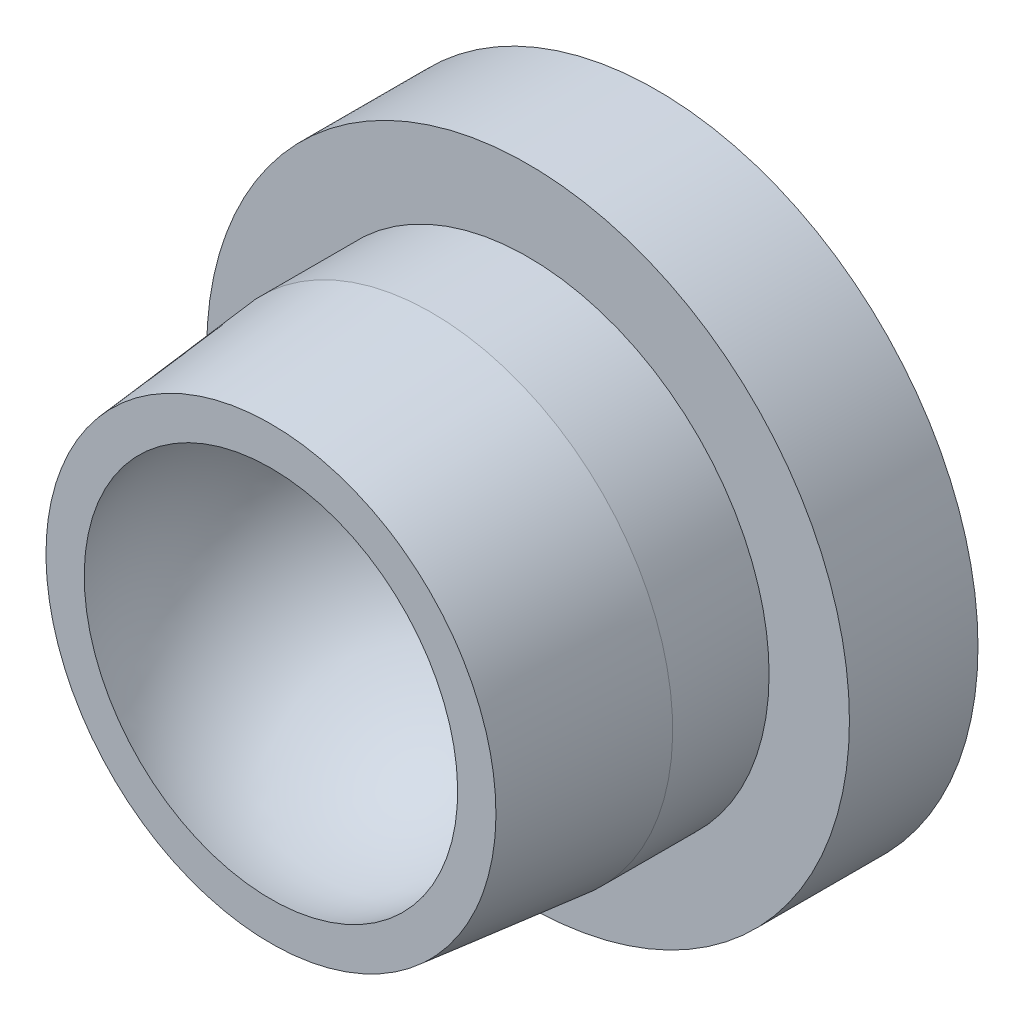
ISO-10303-21;
HEADER;
FILE_DESCRIPTION(('STEP AP214'),'2;1');
FILE_NAME('part.step','',(''),(''),'','','');
FILE_SCHEMA(('AUTOMOTIVE_DESIGN { 1 0 10303 214 1 1 1 1 }'));
ENDSEC;
DATA;
#1=APPLICATION_CONTEXT('core data for automotive mechanical design processes');
#2=APPLICATION_PROTOCOL_DEFINITION('international standard','automotive_design',2000,#1);
#3=PRODUCT_CONTEXT('',#1,'mechanical');
#4=PRODUCT('Part','Part','',(#3));
#5=PRODUCT_RELATED_PRODUCT_CATEGORY('part','',(#4));
#6=PRODUCT_DEFINITION_FORMATION('','',#4);
#7=PRODUCT_DEFINITION_CONTEXT('part definition',#1,'design');
#8=PRODUCT_DEFINITION('design','',#6,#7);
#9=PRODUCT_DEFINITION_SHAPE('','',#8);
#10=(LENGTH_UNIT() NAMED_UNIT(*) SI_UNIT(.MILLI.,.METRE.));
#11=(NAMED_UNIT(*) PLANE_ANGLE_UNIT() SI_UNIT($,.RADIAN.));
#12=(NAMED_UNIT(*) SI_UNIT($,.STERADIAN.) SOLID_ANGLE_UNIT());
#13=UNCERTAINTY_MEASURE_WITH_UNIT(LENGTH_MEASURE(1.E-05),#10,'distance_accuracy_value','');
#14=(GEOMETRIC_REPRESENTATION_CONTEXT(3) GLOBAL_UNCERTAINTY_ASSIGNED_CONTEXT((#13)) GLOBAL_UNIT_ASSIGNED_CONTEXT((#10,
#11,#12)) REPRESENTATION_CONTEXT('',''));
#15=CARTESIAN_POINT('',(0.,0.,0.));
#16=DIRECTION('',(0.,0.,1.));
#17=DIRECTION('',(1.,0.,0.));
#18=AXIS2_PLACEMENT_3D('',#15,#16,#17);
#19=CARTESIAN_POINT('',(0.,0.,4.));
#20=DIRECTION('',(0.,0.,-1.));
#21=DIRECTION('',(-1.,0.,0.));
#22=AXIS2_PLACEMENT_3D('',#19,#20,#21);
#23=CYLINDRICAL_SURFACE('',#22,10.);
#24=CARTESIAN_POINT('',(0.,0.,4.));
#25=DIRECTION('',(0.,0.,1.));
#26=DIRECTION('',(1.,0.,0.));
#27=AXIS2_PLACEMENT_3D('',#24,#25,#26);
#28=CIRCLE('',#27,10.);
#29=CARTESIAN_POINT('',(10.,0.,4.));
#30=VERTEX_POINT('',#29);
#31=EDGE_CURVE('E11',#30,#30,#28,.T.);
#32=ORIENTED_EDGE('',*,*,#31,.F.);
#33=EDGE_LOOP('',(#32));
#34=FACE_BOUND('',#33,.T.);
#35=CARTESIAN_POINT('',(0.,0.,0.));
#36=DIRECTION('',(0.,0.,1.));
#37=DIRECTION('',(1.,0.,0.));
#38=AXIS2_PLACEMENT_3D('',#35,#36,#37);
#39=CIRCLE('',#38,10.);
#40=CARTESIAN_POINT('',(10.,0.,0.));
#41=VERTEX_POINT('',#40);
#42=EDGE_CURVE('E64',#41,#41,#39,.T.);
#43=ORIENTED_EDGE('',*,*,#42,.T.);
#44=EDGE_LOOP('',(#43));
#45=FACE_BOUND('',#44,.T.);
#46=ADVANCED_FACE('F56',(#34,#45),#23,.T.);
#47=CARTESIAN_POINT('',(0.,0.,4.));
#48=DIRECTION('',(0.,0.,1.));
#49=DIRECTION('',(1.,0.,0.));
#50=AXIS2_PLACEMENT_3D('',#47,#48,#49);
#51=PLANE('',#50);
#52=CARTESIAN_POINT('',(0.,0.,4.));
#53=DIRECTION('',(0.,0.,1.));
#54=DIRECTION('',(1.,0.,0.));
#55=AXIS2_PLACEMENT_3D('',#52,#53,#54);
#56=CIRCLE('',#55,7.5);
#57=CARTESIAN_POINT('',(7.5,0.,4.));
#58=VERTEX_POINT('',#57);
#59=EDGE_CURVE('E73',#58,#58,#56,.T.);
#60=ORIENTED_EDGE('',*,*,#59,.F.);
#61=EDGE_LOOP('',(#60));
#62=FACE_BOUND('',#61,.T.);
#63=ORIENTED_EDGE('',*,*,#31,.T.);
#64=EDGE_LOOP('',(#63));
#65=FACE_BOUND('',#64,.T.);
#66=ADVANCED_FACE('F102',(#62,#65),#51,.T.);
#67=CARTESIAN_POINT('',(0.,0.,0.));
#68=DIRECTION('',(0.,0.,1.));
#69=DIRECTION('',(1.,0.,0.));
#70=AXIS2_PLACEMENT_3D('',#67,#68,#69);
#71=PLANE('',#70);
#72=CARTESIAN_POINT('',(0.,0.,0.));
#73=DIRECTION('',(0.,0.,-1.));
#74=DIRECTION('',(-1.,0.,0.));
#75=AXIS2_PLACEMENT_3D('',#72,#73,#74);
#76=CIRCLE('',#75,4.);
#77=CARTESIAN_POINT('',(-4.,0.,0.));
#78=VERTEX_POINT('',#77);
#79=EDGE_CURVE('E229',#78,#78,#76,.T.);
#80=ORIENTED_EDGE('',*,*,#79,.F.);
#81=EDGE_LOOP('',(#80));
#82=FACE_BOUND('',#81,.T.);
#83=ORIENTED_EDGE('',*,*,#42,.F.);
#84=EDGE_LOOP('',(#83));
#85=FACE_BOUND('',#84,.T.);
#86=ADVANCED_FACE('F104',(#82,#85),#71,.F.);
#87=CARTESIAN_POINT('',(0.,0.,7.));
#88=DIRECTION('',(0.,0.,-1.));
#89=DIRECTION('',(-1.,0.,0.));
#90=AXIS2_PLACEMENT_3D('',#87,#88,#89);
#91=CYLINDRICAL_SURFACE('',#90,7.5);
#92=CARTESIAN_POINT('',(0.,0.,7.));
#93=DIRECTION('',(0.,0.,1.));
#94=DIRECTION('',(0.956631448797978,0.291300997544948,0.));
#95=AXIS2_PLACEMENT_3D('',#92,#93,#94);
#96=CIRCLE('',#95,7.5);
#97=CARTESIAN_POINT('',(7.17473586598483,2.18475748158711,7.));
#98=VERTEX_POINT('',#97);
#99=EDGE_CURVE('E219',#98,#98,#96,.T.);
#100=ORIENTED_EDGE('',*,*,#99,.F.);
#101=EDGE_LOOP('',(#100));
#102=FACE_BOUND('',#101,.T.);
#103=ORIENTED_EDGE('',*,*,#59,.T.);
#104=EDGE_LOOP('',(#103));
#105=FACE_BOUND('',#104,.T.);
#106=ADVANCED_FACE('F99',(#102,#105),#91,.T.);
#107=CARTESIAN_POINT('',(0.,0.,12.));
#108=DIRECTION('',(0.,0.,-1.));
#109=DIRECTION('',(-1.,0.,0.));
#110=AXIS2_PLACEMENT_3D('',#107,#108,#109);
#111=CONICAL_SURFACE('',#110,7.,0.0996686524911619);
#112=ORIENTED_EDGE('',*,*,#99,.T.);
#113=EDGE_LOOP('',(#112));
#114=FACE_BOUND('',#113,.T.);
#115=CARTESIAN_POINT('',(7.,0.,12.));
#116=CARTESIAN_POINT('',(7.00000946857829,0.11464018395197,12.));
#117=CARTESIAN_POINT('',(6.99720879617349,0.229281871367744,12.));
#118=CARTESIAN_POINT('',(6.98599072781425,0.458036028501143,12.));
#119=CARTESIAN_POINT('',(6.97758575244608,0.572149107844095,12.));
#120=CARTESIAN_POINT('',(6.95516042019812,0.79984619188303,12.));
#121=CARTESIAN_POINT('',(6.94113890730901,0.913430082788463,12.));
#122=CARTESIAN_POINT('',(6.90750110692619,1.14006992217185,12.));
#123=CARTESIAN_POINT('',(6.88787023727116,1.25312370366495,12.));
#124=CARTESIAN_POINT('',(6.84314425725322,1.47803736977828,12.));
#125=CARTESIAN_POINT('',(6.81805418703437,1.58989825645446,12.));
#126=CARTESIAN_POINT('',(6.76244881002624,1.81202574953683,12.));
#127=CARTESIAN_POINT('',(6.73194449252415,1.92229510503542,12.));
#128=CARTESIAN_POINT('',(6.66552663968088,2.14124188785816,12.));
#129=CARTESIAN_POINT('',(6.62961088236125,2.24991864104084,12.));
#130=CARTESIAN_POINT('',(6.55238689502207,2.4656851734139,12.));
#131=CARTESIAN_POINT('',(6.51106369033482,2.572769590401,12.));
#132=CARTESIAN_POINT('',(6.42330369269825,2.7846682525361,12.));
#133=CARTESIAN_POINT('',(6.37687324275265,2.88948512443638,12.));
#134=CARTESIAN_POINT('',(6.27900174706836,3.09649656838717,12.));
#135=CARTESIAN_POINT('',(6.22757094440642,3.19869598109569,12.));
#136=CARTESIAN_POINT('',(6.11971479620022,3.40047824528328,12.));
#137=CARTESIAN_POINT('',(6.0632874029601,3.50006000211439,12.));
#138=CARTESIAN_POINT('',(5.9454533167807,3.69661499853515,12.));
#139=CARTESIAN_POINT('',(5.88403298289373,3.793580057493,12.));
#140=CARTESIAN_POINT('',(5.75661988375742,3.98428601736692,12.));
#141=CARTESIAN_POINT('',(5.69063282716388,4.0780307320159,12.));
#142=CARTESIAN_POINT('',(5.55425597743965,4.26197072822602,12.));
#143=CARTESIAN_POINT('',(5.48387528620885,4.35217275576092,12.));
#144=CARTESIAN_POINT('',(5.33872579624756,4.52903613944531,12.));
#145=CARTESIAN_POINT('',(5.26395520272269,4.61569602249469,12.));
#146=CARTESIAN_POINT('',(5.11003928805721,4.78548598000882,12.));
#147=CARTESIAN_POINT('',(5.03088218403733,4.86860536981319,12.));
#148=CARTESIAN_POINT('',(4.8687124047155,5.03078990558958,12.));
#149=CARTESIAN_POINT('',(4.78570458435669,5.10985990571818,12.));
#150=CARTESIAN_POINT('',(4.61606326447708,5.26365974295388,12.));
#151=CARTESIAN_POINT('',(4.52943737589153,5.33839797210532,12.));
#152=CARTESIAN_POINT('',(4.35257255820102,5.48354571472726,12.));
#153=CARTESIAN_POINT('',(4.26233215617571,5.55395343325583,12.));
#154=CARTESIAN_POINT('',(4.0782493151659,5.69045341899084,12.));
#155=CARTESIAN_POINT('',(3.98439740418066,5.75653290811392,12.));
#156=CARTESIAN_POINT('',(3.79370303838427,5.88396335904334,12.));
#157=CARTESIAN_POINT('',(3.69686439823091,5.94532002888742,12.));
#158=CARTESIAN_POINT('',(3.50047782897218,6.06306926565418,12.));
#159=CARTESIAN_POINT('',(3.40093572735347,6.11947154819027,12.));
#160=CARTESIAN_POINT('',(3.19915239769337,6.22732570340105,12.));
#161=CARTESIAN_POINT('',(3.09691007520921,6.27877552827064,12.));
#162=CARTESIAN_POINT('',(2.88973450820007,6.37673992432441,12.));
#163=CARTESIAN_POINT('',(2.7847944665566,6.42324011505685,12.));
#164=CARTESIAN_POINT('',(2.57290379182113,6.51101940037376,12.));
#165=CARTESIAN_POINT('',(2.46595578650642,6.5523048375204,12.));
#166=CARTESIAN_POINT('',(2.25037099359016,6.62947843668381,12.));
#167=CARTESIAN_POINT('',(2.14173802607961,6.66537726451744,12.));
#168=CARTESIAN_POINT('',(1.92279060464739,6.73179305761763,12.));
#169=CARTESIAN_POINT('',(1.8124754768193,6.7623078009119,12.));
#170=CARTESIAN_POINT('',(1.59016882466571,6.81797189048315,12.));
#171=CARTESIAN_POINT('',(1.47817343931341,6.84310580657271,12.));
#172=CARTESIAN_POINT('',(1.25322929543939,6.88786061756933,12.));
#173=CARTESIAN_POINT('',(1.14028187683046,6.9074882458219,12.));
#174=CARTESIAN_POINT('',(0.913783662947152,6.94112046924525,12.));
#175=CARTESIAN_POINT('',(0.800234533564133,6.955136270555,12.));
#176=CARTESIAN_POINT('',(0.572537046978295,6.97756137986217,12.));
#177=CARTESIAN_POINT('',(0.458388462303277,6.98596837710925,12.));
#178=CARTESIAN_POINT('',(0.229493844976463,6.99719302045284,12.));
#179=CARTESIAN_POINT('',(0.114747035766647,6.9999947795997,12.));
#180=CARTESIAN_POINT('',(-0.114606099946494,7.00000521398844,12.));
#181=CARTESIAN_POINT('',(-0.229212425893632,6.99722075460051,12.));
#182=CARTESIAN_POINT('',(-0.457919861405459,6.98601913479883,12.));
#183=CARTESIAN_POINT('',(-0.572021523297677,6.97761329020051,12.));
#184=CARTESIAN_POINT('',(-0.799718788321861,6.95518593134012,12.));
#185=CARTESIAN_POINT('',(-0.913314163750184,6.9411621063505,12.));
#186=CARTESIAN_POINT('',(-1.1400004544726,6.90751594671759,12.));
#187=CARTESIAN_POINT('',(-1.25308903201324,6.88787787888898,12.));
#188=CARTESIAN_POINT('',(-1.47803724718358,6.84314353568217,12.));
#189=CARTESIAN_POINT('',(-1.58989822363506,6.81805399386651,12.));
#190=CARTESIAN_POINT('',(-1.8120257822897,6.76244900280689,12.));
#191=CARTESIAN_POINT('',(-1.92229511381365,6.73194454419437,12.));
#192=CARTESIAN_POINT('',(-2.1412418790754,6.66552658799002,12.));
#193=CARTESIAN_POINT('',(-2.24991863868423,6.62961086849339,12.));
#194=CARTESIAN_POINT('',(-2.46568517577652,6.55238690892964,12.));
#195=CARTESIAN_POINT('',(-2.5727695910336,6.51106369405901,12.));
#196=CARTESIAN_POINT('',(-2.78466825190427,6.42330368897864,12.));
#197=CARTESIAN_POINT('',(-2.88948512426743,6.37687324175675,12.));
#198=CARTESIAN_POINT('',(-3.09649656855639,6.27900174806183,12.));
#199=CARTESIAN_POINT('',(-3.19869598114137,6.22757094467247,12.));
#200=CARTESIAN_POINT('',(-3.40047824523843,6.11971479593347,12.));
#201=CARTESIAN_POINT('',(-3.50006000210263,6.06328740288836,12.));
#202=CARTESIAN_POINT('',(-3.69661499854756,5.94545331685223,12.));
#203=CARTESIAN_POINT('',(-3.79358005749637,5.88403298291284,12.));
#204=CARTESIAN_POINT('',(-3.98428601736387,5.75661988373812,12.));
#205=CARTESIAN_POINT('',(-4.07803073201542,5.69063282715849,12.));
#206=CARTESIAN_POINT('',(-4.26197072822755,5.55425597744434,12.));
#207=CARTESIAN_POINT('',(-4.35217275576189,5.48387528620974,12.));
#208=CARTESIAN_POINT('',(-4.52903613944581,5.33872579624571,12.));
#209=CARTESIAN_POINT('',(-4.6156960224953,5.26395520272189,12.));
#210=CARTESIAN_POINT('',(-4.78548598000929,5.11003928805732,12.));
#211=CARTESIAN_POINT('',(-4.8686053698134,5.03088218403729,12.));
#212=CARTESIAN_POINT('',(-5.03078990558964,4.86871240471526,12.));
#213=CARTESIAN_POINT('',(-5.10985990571831,4.78570458435639,12.));
#214=CARTESIAN_POINT('',(-5.2636597429541,4.61606326447664,12.));
#215=CARTESIAN_POINT('',(-5.33839797210557,4.52943737589103,12.));
#216=CARTESIAN_POINT('',(-5.48354571472751,4.35257255820051,12.));
#217=CARTESIAN_POINT('',(-5.55395343325606,4.26233215617525,12.));
#218=CARTESIAN_POINT('',(-5.69045341899098,4.07824931516562,12.));
#219=CARTESIAN_POINT('',(-5.75653290811399,3.98439740418052,12.));
#220=CARTESIAN_POINT('',(-5.88396335904335,3.7937030383843,12.));
#221=CARTESIAN_POINT('',(-5.94532002888742,3.69686439823097,12.));
#222=CARTESIAN_POINT('',(-6.0630692656542,3.50047782897228,12.));
#223=CARTESIAN_POINT('',(-6.11947154819028,3.40093572735357,12.));
#224=CARTESIAN_POINT('',(-6.22732570340107,3.19915239769348,12.));
#225=CARTESIAN_POINT('',(-6.27877552827066,3.0969100752093,12.));
#226=CARTESIAN_POINT('',(-6.37673992432442,2.88973450820012,12.));
#227=CARTESIAN_POINT('',(-6.42324011505686,2.78479446655663,12.));
#228=CARTESIAN_POINT('',(-6.51101940037365,2.57290379182133,12.));
#229=CARTESIAN_POINT('',(-6.5523048375202,2.46595578650681,12.));
#230=CARTESIAN_POINT('',(-6.62947843668348,2.25037099359083,12.));
#231=CARTESIAN_POINT('',(-6.66537726451707,2.14173802608034,12.));
#232=CARTESIAN_POINT('',(-6.73179305761726,1.92279060464812,12.));
#233=CARTESIAN_POINT('',(-6.76230780091156,1.81247547681997,12.));
#234=CARTESIAN_POINT('',(-6.81797189048294,1.59016882466612,12.));
#235=CARTESIAN_POINT('',(-6.84310580657261,1.47817343931361,12.));
#236=CARTESIAN_POINT('',(-6.88786061756932,1.25322929543968,12.));
#237=CARTESIAN_POINT('',(-6.9074882458219,1.14028187683105,12.));
#238=CARTESIAN_POINT('',(-6.94112046924527,0.913783662948119,12.));
#239=CARTESIAN_POINT('',(-6.95513627055501,0.800234533565194,12.));
#240=CARTESIAN_POINT('',(-6.97756137986218,0.572537046979354,12.));
#241=CARTESIAN_POINT('',(-6.98596837710926,0.45838846230424,12.));
#242=CARTESIAN_POINT('',(-6.99719302045284,0.229493844977042,12.));
#243=CARTESIAN_POINT('',(-6.9999947795997,0.114747035766936,12.));
#244=CARTESIAN_POINT('',(-7.00000521398844,-0.114606099946784,12.));
#245=CARTESIAN_POINT('',(-6.99722075460051,-0.229212425894214,12.));
#246=CARTESIAN_POINT('',(-6.98601913479883,-0.457919861406428,12.));
#247=CARTESIAN_POINT('',(-6.97761329020052,-0.572021523298744,12.));
#248=CARTESIAN_POINT('',(-6.95518593134013,-0.799718788322929,12.));
#249=CARTESIAN_POINT('',(-6.94116210635052,-0.913314163751156,12.));
#250=CARTESIAN_POINT('',(-6.9075159467176,-1.14000045447318,12.));
#251=CARTESIAN_POINT('',(-6.88787787888898,-1.25308903201354,12.));
#252=CARTESIAN_POINT('',(-6.84314353568213,-1.47803724718348,12.));
#253=CARTESIAN_POINT('',(-6.81805399386642,-1.58989822363485,12.));
#254=CARTESIAN_POINT('',(-6.76244900280674,-1.81202578228934,12.));
#255=CARTESIAN_POINT('',(-6.73194454419422,-1.92229511381326,12.));
#256=CARTESIAN_POINT('',(-6.66552658798986,-2.141241879075,12.));
#257=CARTESIAN_POINT('',(-6.62961086849324,-2.24991863868387,12.));
#258=CARTESIAN_POINT('',(-6.55238690892955,-2.4656851757763,12.));
#259=CARTESIAN_POINT('',(-6.51106369405898,-2.5727695910335,12.));
#260=CARTESIAN_POINT('',(-6.42330368897903,-2.78466825190351,12.));
#261=CARTESIAN_POINT('',(-6.37687324175754,-2.88948512426593,12.));
#262=CARTESIAN_POINT('',(-6.27900174806315,-3.09649656855388,12.));
#263=CARTESIAN_POINT('',(-6.22757094467392,-3.1986959811386,12.));
#264=CARTESIAN_POINT('',(-6.1197147959349,-3.40047824523566,12.));
#265=CARTESIAN_POINT('',(-6.06328740288964,-3.5000600021001,12.));
#266=CARTESIAN_POINT('',(-5.94545331685302,-3.69661499854605,12.));
#267=CARTESIAN_POINT('',(-5.88403298291325,-3.79358005749562,12.));
#268=CARTESIAN_POINT('',(-5.75661988373871,-3.98428601736312,12.));
#269=CARTESIAN_POINT('',(-5.69063282715969,-4.07803073201396,12.));
#270=CARTESIAN_POINT('',(-5.55425597744637,-4.26197072822512,12.));
#271=CARTESIAN_POINT('',(-5.48387528621195,-4.3521727557592,12.));
#272=CARTESIAN_POINT('',(-5.33872579624791,-4.52903613944312,12.));
#273=CARTESIAN_POINT('',(-5.26395520272388,-4.61569602249283,12.));
#274=CARTESIAN_POINT('',(-5.11003928805852,-4.78548598000781,12.));
#275=CARTESIAN_POINT('',(-5.0308821840379,-4.86860536981267,12.));
#276=CARTESIAN_POINT('',(-4.86871240471547,-5.03078990558955,12.));
#277=CARTESIAN_POINT('',(-4.78570458435682,-5.10985990571817,12.));
#278=CARTESIAN_POINT('',(-4.61606326447736,-5.26365974295388,12.));
#279=CARTESIAN_POINT('',(-4.52943737589182,-5.33839797210531,12.));
#280=CARTESIAN_POINT('',(-4.35257255820129,-5.48354571472725,12.));
#281=CARTESIAN_POINT('',(-4.26233215617596,-5.55395343325582,12.));
#282=CARTESIAN_POINT('',(-4.07824931516605,-5.69045341899084,12.));
#283=CARTESIAN_POINT('',(-3.98439740418074,-5.75653290811392,12.));
#284=CARTESIAN_POINT('',(-3.79370303838416,-5.88396335904337,12.));
#285=CARTESIAN_POINT('',(-3.69686439823069,-5.94532002888747,12.));
#286=CARTESIAN_POINT('',(-3.50047782897181,-6.06306926565428,12.));
#287=CARTESIAN_POINT('',(-3.40093572735306,-6.11947154819037,12.));
#288=CARTESIAN_POINT('',(-3.19915239769297,-6.22732570340116,12.));
#289=CARTESIAN_POINT('',(-3.09691007520884,-6.27877552827074,12.));
#290=CARTESIAN_POINT('',(-2.88973450819985,-6.37673992432447,12.));
#291=CARTESIAN_POINT('',(-2.78479446655649,-6.42324011505688,12.));
#292=CARTESIAN_POINT('',(-2.57290379182126,-6.51101940037372,12.));
#293=CARTESIAN_POINT('',(-2.46595578650666,-6.55230483752033,12.));
#294=CARTESIAN_POINT('',(-2.25037099359057,-6.62947843668369,12.));
#295=CARTESIAN_POINT('',(-2.14173802608006,-6.6653772645173,12.));
#296=CARTESIAN_POINT('',(-1.92279060464784,-6.7317930576175,12.));
#297=CARTESIAN_POINT('',(-1.81247547681971,-6.76230780091177,12.));
#298=CARTESIAN_POINT('',(-1.59016882466596,-6.81797189048307,12.));
#299=CARTESIAN_POINT('',(-1.47817343931353,-6.84310580657267,12.));
#300=CARTESIAN_POINT('',(-1.25322929543946,-6.88786061756932,12.));
#301=CARTESIAN_POINT('',(-1.14028187683059,-6.9074882458219,12.));
#302=CARTESIAN_POINT('',(-0.913783662947359,-6.94112046924526,12.));
#303=CARTESIAN_POINT('',(-0.80023453356436,-6.955136270555,12.));
#304=CARTESIAN_POINT('',(-0.572537046978521,-6.97756137986217,12.));
#305=CARTESIAN_POINT('',(-0.458388462303483,-6.98596837710925,12.));
#306=CARTESIAN_POINT('',(-0.229493844976587,-6.99719302045284,12.));
#307=CARTESIAN_POINT('',(-0.114747035766709,-6.9999947795997,12.));
#308=CARTESIAN_POINT('',(0.114606099946554,-7.00000521398844,12.));
#309=CARTESIAN_POINT('',(0.229212425893752,-6.99722075460051,12.));
#310=CARTESIAN_POINT('',(0.457919861405659,-6.98601913479883,12.));
#311=CARTESIAN_POINT('',(0.572021523297898,-6.97761329020051,12.));
#312=CARTESIAN_POINT('',(0.799718788322082,-6.95518593134012,12.));
#313=CARTESIAN_POINT('',(0.913314163750385,-6.9411621063505,12.));
#314=CARTESIAN_POINT('',(1.14000045447272,-6.90751594671759,12.));
#315=CARTESIAN_POINT('',(1.25308903201331,-6.88787787888898,12.));
#316=CARTESIAN_POINT('',(1.47803724718371,-6.84314353568214,12.));
#317=CARTESIAN_POINT('',(1.5898982236353,-6.81805399386644,12.));
#318=CARTESIAN_POINT('',(1.8120257822901,-6.76244900280676,12.));
#319=CARTESIAN_POINT('',(1.9222951138141,-6.73194454419424,12.));
#320=CARTESIAN_POINT('',(2.14124187907584,-6.66552658798989,12.));
#321=CARTESIAN_POINT('',(2.24991863868464,-6.62961086849327,12.));
#322=CARTESIAN_POINT('',(2.46568517577676,-6.55238690892957,12.));
#323=CARTESIAN_POINT('',(2.57276959103372,-6.51106369405897,12.));
#324=CARTESIAN_POINT('',(2.78466825190434,-6.4233036889786,12.));
#325=CARTESIAN_POINT('',(2.88948512426757,-6.37687324175666,12.));
#326=CARTESIAN_POINT('',(3.0964965685566,-6.27900174806168,12.));
#327=CARTESIAN_POINT('',(3.19869598114161,-6.22757094467232,12.));
#328=CARTESIAN_POINT('',(3.40047824523867,-6.11971479593332,12.));
#329=CARTESIAN_POINT('',(3.50006000210285,-6.06328740288822,12.));
#330=CARTESIAN_POINT('',(3.69661499854769,-5.94545331685215,12.));
#331=CARTESIAN_POINT('',(3.79358005749643,-5.8840329829128,12.));
#332=CARTESIAN_POINT('',(3.98428601736387,-5.75661988373812,12.));
#333=CARTESIAN_POINT('',(4.07803073201544,-5.69063282715848,12.));
#334=CARTESIAN_POINT('',(4.26197072822757,-5.55425597744431,12.));
#335=CARTESIAN_POINT('',(4.35217275576191,-5.48387528620972,12.));
#336=CARTESIAN_POINT('',(4.52903613944584,-5.33872579624568,12.));
#337=CARTESIAN_POINT('',(4.61569602249534,-5.26395520272187,12.));
#338=CARTESIAN_POINT('',(4.78548598000927,-5.1100392880573,12.));
#339=CARTESIAN_POINT('',(4.86860536981332,-5.03088218403726,12.));
#340=CARTESIAN_POINT('',(5.03078990559005,-4.86871240471496,12.));
#341=CARTESIAN_POINT('',(5.10985990571929,-4.78570458435581,12.));
#342=CARTESIAN_POINT('',(5.26365974295487,-4.61606326447549,12.));
#343=CARTESIAN_POINT('',(5.33839797210558,-4.5294373758896,12.));
#344=CARTESIAN_POINT('',(5.4835457147299,-4.35257255819959,12.));
#345=CARTESIAN_POINT('',(5.5539534332616,-4.26233215617513,12.));
#346=CARTESIAN_POINT('',(5.69045341898719,-4.07824931516403,12.));
#347=CARTESIAN_POINT('',(5.7565329080977,-3.98439740417666,12.));
#348=CARTESIAN_POINT('',(5.88396335906004,-3.79370303838752,12.));
#349=CARTESIAN_POINT('',(5.94532002894949,-3.6968643982435,12.));
#350=CARTESIAN_POINT('',(6.06306926559275,-3.50047782895808,12.));
#351=CARTESIAN_POINT('',(6.11947154796038,-3.40093572730342,12.));
#352=CARTESIAN_POINT('',(6.22732570363177,-3.19915239774134,12.));
#353=CARTESIAN_POINT('',(6.27877552913076,-3.09691007539121,12.));
#354=CARTESIAN_POINT('',(6.37673992346239,-2.88973450801603,12.));
#355=CARTESIAN_POINT('',(6.42324011183485,-2.78479446587069,12.));
#356=CARTESIAN_POINT('',(6.51101940359186,-2.57290379250604,12.));
#357=CARTESIAN_POINT('',(6.55230484952487,-2.46595578906108,12.));
#358=CARTESIAN_POINT('',(6.62947842470324,-2.25037099104129,12.));
#359=CARTESIAN_POINT('',(6.66537721984883,-2.14173801657518,12.));
#360=CARTESIAN_POINT('',(6.73179310230436,-1.92279061415663,12.));
#361=CARTESIAN_POINT('',(6.76230796770571,-1.81247551231132,12.));
#362=CARTESIAN_POINT('',(6.81797172321706,-1.5901687890739,12.));
#363=CARTESIAN_POINT('',(6.84310518150196,-1.47817330630652,12.));
#364=CARTESIAN_POINT('',(6.88786817030886,-1.2531946059736,12.));
#365=CARTESIAN_POINT('',(6.90750273668694,-1.14021239049882,12.));
#366=CARTESIAN_POINT('',(6.94114408017809,-0.913667616435136,12.));
#367=CARTESIAN_POINT('',(6.95516321573665,-0.800106895520725,12.));
#368=CARTESIAN_POINT('',(6.97758757247446,-0.572409495345156,12.));
#369=CARTESIAN_POINT('',(6.98599163793147,-0.458272702381738,12.));
#370=CARTESIAN_POINT('',(6.99721020121738,-0.229423844172278,12.));
#371=CARTESIAN_POINT('',(7.00000995469383,-0.114711055369797,12.));
#372=CARTESIAN_POINT('',(7.,0.,12.));
#373=B_SPLINE_CURVE_WITH_KNOTS('',3,(#115,#116,#117,#118,#119,#120,#121,#122,#123,#124,#125,
#126,#127,#128,#129,#130,#131,#132,#133,#134,#135,#136,#137,#138,#139,#140,#141,#142,#143,#144,
#145,#146,#147,#148,#149,#150,#151,#152,#153,#154,#155,#156,#157,#158,#159,#160,#161,#162,#163,
#164,#165,#166,#167,#168,#169,#170,#171,#172,#173,#174,#175,#176,#177,#178,#179,#180,#181,#182,
#183,#184,#185,#186,#187,#188,#189,#190,#191,#192,#193,#194,#195,#196,#197,#198,#199,#200,#201,
#202,#203,#204,#205,#206,#207,#208,#209,#210,#211,#212,#213,#214,#215,#216,#217,#218,#219,#220,
#221,#222,#223,#224,#225,#226,#227,#228,#229,#230,#231,#232,#233,#234,#235,#236,#237,#238,#239,
#240,#241,#242,#243,#244,#245,#246,#247,#248,#249,#250,#251,#252,#253,#254,#255,#256,#257,#258,
#259,#260,#261,#262,#263,#264,#265,#266,#267,#268,#269,#270,#271,#272,#273,#274,#275,#276,#277,
#278,#279,#280,#281,#282,#283,#284,#285,#286,#287,#288,#289,#290,#291,#292,#293,#294,#295,#296,
#297,#298,#299,#300,#301,#302,#303,#304,#305,#306,#307,#308,#309,#310,#311,#312,#313,#314,#315,
#316,#317,#318,#319,#320,#321,#322,#323,#324,#325,#326,#327,#328,#329,#330,#331,#332,#333,#334,
#335,#336,#337,#338,#339,#340,#341,#342,#343,#344,#345,#346,#347,#348,#349,#350,#351,#352,#353,
#354,#355,#356,#357,#358,#359,#360,#361,#362,#363,#364,#365,#366,#367,#368,#369,#370,#371,#372),
.UNSPECIFIED.,.F.,.F.,(4,2,2,2,2,2,2,2,2,2,2,2,2,2,2,2,2,2,2,2,2,2,2,2,2,2,2,2,2,2,2,2,2,2,2,2,
2,2,2,2,2,2,2,2,2,2,2,2,2,2,2,2,2,2,2,2,2,2,2,2,2,2,2,2,2,2,2,2,2,2,2,2,2,2,2,2,2,2,2,2,2,2,2,2,
2,2,2,2,2,2,2,2,2,2,2,2,2,2,2,2,2,2,2,2,2,2,2,2,2,2,2,2,2,2,2,2,2,2,2,2,2,2,2,2,2,2,2,2,4),(0.,
0.343888179007135,0.687016734834332,1.03021595052798,1.37431559764619,1.71809889661094,
2.06119223659397,2.40442683918356,2.74863290256632,3.09241620153055,3.4355095415134,
3.77874414410318,4.12295020748648,4.46673350644941,4.80982684643184,5.15306144902204,
5.4972675124066,5.84105081136896,6.18414415135119,6.52737875394159,6.87158481732677,
7.21536811628991,7.5584614562724,7.90169605886254,8.24590212224692,8.58968542121108,
8.93277876119392,9.27601336378372,9.62021942716708,9.96400272613199,10.3070960661151,
10.6503306687046,10.9945367320872,11.3383200310514,11.6814133710342,12.024647973624,
12.3688540370074,12.7126373359717,13.0557306759546,13.3989652785443,13.7431713419275,
14.0869546408922,14.4300479808752,14.7732825834648,15.1174886468477,15.4612719458113,
15.804365285794,16.147599888384,16.4918059517678,16.8355892507306,17.178682590713,
17.5219171933032,17.866123256688,18.209906555651,18.5529998956335,18.8962344982237,
19.2404405616081,19.5842238605716,19.9273172005542,20.2705518031443,20.6147578665283,
20.9585411654923,21.3016345054751,21.644869108065,21.9890751714484,22.3328584704135,
22.6759518103966,23.0191864129861,23.3633924763686,23.7071757753326,24.0502691153154,
24.3935037179053,24.7377097812887,25.0814930802508,25.4245864202329,25.7678210228234,
26.1120270862088,26.4558103851697,26.7989037251514,27.1421383277423,27.486344391129,
27.8301276900912,28.1732210300733,28.5164556326638,28.8606616960492,29.2044449950126,
29.5475383349952,29.8907729375853,30.2349790009693,30.5787622999331,30.9218556399158,
31.2650902425057,31.6092963058895,31.9530796048542,32.2961729448372,32.6394075474268,
32.9836136108096,33.327396909774,33.6704902497569,34.0137248523466,34.3579309157298,
34.7017142146945,35.0448075546775,35.3880421572671,35.7322482206499,36.0760315196148,
36.4191248595979,36.7623594621874,37.1065655255701,37.4503488245338,37.7934421645164,
38.1366767671064,38.4808828304902,38.8246661294544,39.1677594694372,39.510994072027,
39.8552001354104,40.1989834343744,40.5420767743572,40.885311376947,41.2295174403305,
41.5733007392943,41.916394079277,42.2596286818669,42.6038347452507,42.9477245480186,
43.2908533036879,43.6340526621209,43.9781537612659),.UNSPECIFIED.);
#374=CARTESIAN_POINT('',(7.,0.,12.));
#375=VERTEX_POINT('',#374);
#376=EDGE_CURVE('E70',#375,#375,#373,.T.);
#377=ORIENTED_EDGE('',*,*,#376,.F.);
#378=EDGE_LOOP('',(#377));
#379=FACE_BOUND('',#378,.T.);
#380=ADVANCED_FACE('F97',(#114,#379),#111,.T.);
#381=CARTESIAN_POINT('',(0.,0.,12.));
#382=DIRECTION('',(0.,0.,1.));
#383=DIRECTION('',(1.,0.,0.));
#384=AXIS2_PLACEMENT_3D('',#381,#382,#383);
#385=PLANE('',#384);
#386=CARTESIAN_POINT('',(0.,0.,12.));
#387=DIRECTION('',(0.,0.,-1.));
#388=DIRECTION('',(-1.,0.,0.));
#389=AXIS2_PLACEMENT_3D('',#386,#387,#388);
#390=CIRCLE('',#389,5.80947501931113);
#391=CARTESIAN_POINT('',(0.,5.80947501931113,12.));
#392=VERTEX_POINT('',#391);
#393=EDGE_CURVE('E246',#392,#392,#390,.T.);
#394=ORIENTED_EDGE('',*,*,#393,.T.);
#395=EDGE_LOOP('',(#394));
#396=FACE_BOUND('',#395,.T.);
#397=ORIENTED_EDGE('',*,*,#376,.T.);
#398=EDGE_LOOP('',(#397));
#399=FACE_BOUND('',#398,.T.);
#400=ADVANCED_FACE('F86',(#396,#399),#385,.T.);
#401=CARTESIAN_POINT('',(0.,0.,2.));
#402=DIRECTION('',(0.,0.,-1.));
#403=DIRECTION('',(-1.,0.,0.));
#404=AXIS2_PLACEMENT_3D('',#401,#402,#403);
#405=CYLINDRICAL_SURFACE('',#404,4.);
#406=CARTESIAN_POINT('',(0.,0.,2.));
#407=DIRECTION('',(0.,0.,-1.));
#408=DIRECTION('',(-1.,0.,0.));
#409=AXIS2_PLACEMENT_3D('',#406,#407,#408);
#410=CIRCLE('',#409,4.);
#411=CARTESIAN_POINT('',(-4.,0.,2.));
#412=VERTEX_POINT('',#411);
#413=EDGE_CURVE('E224',#412,#412,#410,.T.);
#414=ORIENTED_EDGE('',*,*,#413,.F.);
#415=EDGE_LOOP('',(#414));
#416=FACE_BOUND('',#415,.T.);
#417=ORIENTED_EDGE('',*,*,#79,.T.);
#418=EDGE_LOOP('',(#417));
#419=FACE_BOUND('',#418,.T.);
#420=ADVANCED_FACE('F96',(#416,#419),#405,.F.);
#421=CARTESIAN_POINT('',(0.,0.,2.));
#422=DIRECTION('',(0.,0.,-1.));
#423=DIRECTION('',(-1.,0.,0.));
#424=AXIS2_PLACEMENT_3D('',#421,#422,#423);
#425=PLANE('',#424);
#426=CARTESIAN_POINT('',(0.,0.,2.));
#427=DIRECTION('',(0.,0.,-1.));
#428=DIRECTION('',(-1.,0.,0.));
#429=AXIS2_PLACEMENT_3D('',#426,#427,#428);
#430=CIRCLE('',#429,0.5);
#431=CARTESIAN_POINT('',(-0.5,0.,2.));
#432=VERTEX_POINT('',#431);
#433=EDGE_CURVE('E235',#432,#432,#430,.T.);
#434=ORIENTED_EDGE('',*,*,#433,.F.);
#435=EDGE_LOOP('',(#434));
#436=FACE_BOUND('',#435,.T.);
#437=ORIENTED_EDGE('',*,*,#413,.T.);
#438=EDGE_LOOP('',(#437));
#439=FACE_BOUND('',#438,.T.);
#440=ADVANCED_FACE('F148',(#436,#439),#425,.T.);
#441=CARTESIAN_POINT('',(0.,0.,12.0125));
#442=DIRECTION('',(0.,0.,-1.));
#443=DIRECTION('',(-1.,0.,0.));
#444=AXIS2_PLACEMENT_3D('',#441,#442,#443);
#445=CYLINDRICAL_SURFACE('',#444,0.5);
#446=CARTESIAN_POINT('',(0.,0.,3.5));
#447=DIRECTION('',(0.,0.,-1.));
#448=DIRECTION('',(-1.,0.,0.));
#449=AXIS2_PLACEMENT_3D('',#446,#447,#448);
#450=CIRCLE('',#449,0.5);
#451=CARTESIAN_POINT('',(-0.5,0.,3.5));
#452=VERTEX_POINT('',#451);
#453=EDGE_CURVE('E241',#452,#452,#450,.F.);
#454=ORIENTED_EDGE('',*,*,#453,.T.);
#455=EDGE_LOOP('',(#454));
#456=FACE_BOUND('',#455,.T.);
#457=ORIENTED_EDGE('',*,*,#433,.T.);
#458=EDGE_LOOP('',(#457));
#459=FACE_BOUND('',#458,.T.);
#460=ADVANCED_FACE('F158',(#456,#459),#445,.F.);
#461=CARTESIAN_POINT('',(0.,0.,3.5));
#462=DIRECTION('',(0.,0.,-1.));
#463=DIRECTION('',(-1.,0.,0.));
#464=AXIS2_PLACEMENT_3D('',#461,#462,#463);
#465=PLANE('',#464);
#466=CARTESIAN_POINT('',(0.,0.,3.5));
#467=DIRECTION('',(0.,0.,-1.));
#468=DIRECTION('',(-1.,0.,0.));
#469=AXIS2_PLACEMENT_3D('',#466,#467,#468);
#470=CIRCLE('',#469,2.);
#471=CARTESIAN_POINT('',(-2.,0.,3.5));
#472=VERTEX_POINT('',#471);
#473=EDGE_CURVE('E242',#472,#472,#470,.T.);
#474=ORIENTED_EDGE('',*,*,#473,.F.);
#475=EDGE_LOOP('',(#474));
#476=FACE_BOUND('',#475,.T.);
#477=ORIENTED_EDGE('',*,*,#453,.F.);
#478=EDGE_LOOP('',(#477));
#479=FACE_BOUND('',#478,.T.);
#480=ADVANCED_FACE('F168',(#476,#479),#465,.F.);
#481=CARTESIAN_POINT('',(0.,0.,12.0125));
#482=DIRECTION('',(0.,0.,-1.));
#483=DIRECTION('',(-1.,0.,0.));
#484=AXIS2_PLACEMENT_3D('',#481,#482,#483);
#485=CYLINDRICAL_SURFACE('',#484,2.);
#486=CARTESIAN_POINT('',(0.,0.,4.84314575050762));
#487=DIRECTION('',(0.,0.,1.));
#488=DIRECTION('',(1.,0.,0.));
#489=AXIS2_PLACEMENT_3D('',#486,#487,#488);
#490=CIRCLE('',#489,2.);
#491=CARTESIAN_POINT('',(0.,2.,4.84314575050762));
#492=VERTEX_POINT('',#491);
#493=EDGE_CURVE('E59',#492,#492,#490,.T.);
#494=ORIENTED_EDGE('',*,*,#493,.T.);
#495=EDGE_LOOP('',(#494));
#496=FACE_BOUND('',#495,.T.);
#497=ORIENTED_EDGE('',*,*,#473,.T.);
#498=EDGE_LOOP('',(#497));
#499=FACE_BOUND('',#498,.T.);
#500=ADVANCED_FACE('F178',(#496,#499),#485,.F.);
#501=CARTESIAN_POINT('',(0.,0.,10.5));
#502=DIRECTION('',(0.,0.,-1.));
#503=DIRECTION('',(0.,1.,0.));
#504=AXIS2_PLACEMENT_3D('',#501,#502,#503);
#505=SPHERICAL_SURFACE('',#504,6.);
#506=CARTESIAN_POINT('',(0.,5.80947501931113,12.));
#507=CARTESIAN_POINT('',(0.,5.83265851280018,11.9102173462531));
#508=CARTESIAN_POINT('',(0.,5.85375748249553,11.8198966083544));
#509=CARTESIAN_POINT('',(0.,5.891748159588,11.6383745751776));
#510=CARTESIAN_POINT('',(0.,5.90863986698512,11.5471732798994));
#511=CARTESIAN_POINT('',(0.,5.93817780477027,11.3640857428875));
#512=CARTESIAN_POINT('',(0.,5.9508240351583,11.2721995011537));
#513=CARTESIAN_POINT('',(0.,5.97184435151758,11.0879396613439));
#514=CARTESIAN_POINT('',(0.,5.98021843748883,10.9955660632679));
#515=CARTESIAN_POINT('',(0.,5.99267633014038,10.8105300124434));
#516=CARTESIAN_POINT('',(0.,5.99676013682069,10.7178675596948));
#517=CARTESIAN_POINT('',(0.,6.00062873068772,10.5324529584122));
#518=CARTESIAN_POINT('',(0.,6.00041351787445,10.4397008098781));
#519=CARTESIAN_POINT('',(0.,5.99568452544208,10.2543061589312));
#520=CARTESIAN_POINT('',(0.,5.99117074582299,10.1616636565185));
#521=CARTESIAN_POINT('',(0.,5.97785432348458,9.97668740668237));
#522=CARTESIAN_POINT('',(0.,5.96905168076526,9.88435365925904));
#523=CARTESIAN_POINT('',(0.,5.94717645025868,9.7001933639898));
#524=CARTESIAN_POINT('',(0.,5.9341038624714,9.6083668161439));
#525=CARTESIAN_POINT('',(0.,5.90371683777215,9.42541827472609));
#526=CARTESIAN_POINT('',(0.,5.88640240086018,9.33429628115419));
#527=CARTESIAN_POINT('',(0.,5.84756889024473,9.15295268869466));
#528=CARTESIAN_POINT('',(0.,5.82604981654125,9.06273108980703));
#529=CARTESIAN_POINT('',(0.,5.77885328139338,8.88338219200134));
#530=CARTESIAN_POINT('',(0.,5.75317581994899,8.79425489308328));
#531=CARTESIAN_POINT('',(0.,5.69771769560668,8.61728614861649));
#532=CARTESIAN_POINT('',(0.,5.66793703270876,8.52944470306777));
#533=CARTESIAN_POINT('',(0.,5.60433651039846,8.3552364551698));
#534=CARTESIAN_POINT('',(0.,5.57051665098608,8.26886965282055));
#535=CARTESIAN_POINT('',(0.,5.49891042167158,8.09779631183151));
#536=CARTESIAN_POINT('',(0.,5.46112405176946,8.01308977319173));
#537=CARTESIAN_POINT('',(0.,5.38166601236983,7.8455190118741));
#538=CARTESIAN_POINT('',(0.,5.33999434287231,7.76265478919627));
#539=CARTESIAN_POINT('',(0.,5.25285526550605,7.59894675252869));
#540=CARTESIAN_POINT('',(0.,5.20738785763729,7.51810293853895));
#541=CARTESIAN_POINT('',(0.,5.11275502259665,7.35860946968843));
#542=CARTESIAN_POINT('',(0.,5.06358959542476,7.27995981482765));
#543=CARTESIAN_POINT('',(0.,4.96166638867087,7.12502369896438));
#544=CARTESIAN_POINT('',(0.,4.90890860908887,7.04873723796188));
#545=CARTESIAN_POINT('',(0.,4.79991408513245,6.89869146554115));
#546=CARTESIAN_POINT('',(0.,4.74367734075802,6.82493215412291));
#547=CARTESIAN_POINT('',(0.,4.62784575186446,6.68009920521931));
#548=CARTESIAN_POINT('',(0.,4.56825090734533,6.60902556773396));
#549=CARTESIAN_POINT('',(0.,4.44583120007875,6.46971671895958));
#550=CARTESIAN_POINT('',(0.,4.3830063373313,6.40148150767054));
#551=CARTESIAN_POINT('',(0.,4.25426161750961,6.26799616319077));
#552=CARTESIAN_POINT('',(0.,4.18834176043536,6.20274603000005));
#553=CARTESIAN_POINT('',(0.,4.05354872768323,6.07537107799433));
#554=CARTESIAN_POINT('',(0.,3.98467555200535,6.01324625917934));
#555=CARTESIAN_POINT('',(0.,3.84412390498244,5.89225545546882));
#556=CARTESIAN_POINT('',(0.,3.77244543363742,5.83338947057329));
#557=CARTESIAN_POINT('',(0.,3.62643724773505,5.71904284947402));
#558=CARTESIAN_POINT('',(0.,3.55210753317769,5.66356221327028));
#559=CARTESIAN_POINT('',(0.,3.40095661009956,5.55610553166435));
#560=CARTESIAN_POINT('',(0.,3.32413540157878,5.50412948626215));
#561=CARTESIAN_POINT('',(0.,3.16816659937608,5.40379368444263));
#562=CARTESIAN_POINT('',(0.,3.08901900569415,5.3554339280253));
#563=CARTESIAN_POINT('',(0.,2.92856752392732,5.26243467430311));
#564=CARTESIAN_POINT('',(0.,2.84726363584242,5.21779517699824));
#565=CARTESIAN_POINT('',(0.,2.68267435730367,5.13233225137164));
#566=CARTESIAN_POINT('',(0.,2.59938896684982,5.09150882304991));
#567=CARTESIAN_POINT('',(0.,2.43101548443798,5.01376625814357));
#568=CARTESIAN_POINT('',(0.,2.34592739247998,4.97684712155897));
#569=CARTESIAN_POINT('',(0.,2.17413211471397,4.90699067867867));
#570=CARTESIAN_POINT('',(0.,2.08742492890595,4.87405337238298));
#571=CARTESIAN_POINT('',(0.,2.,4.84314575050762));
#572=B_SPLINE_CURVE_WITH_KNOTS('',3,(#506,#507,#508,#509,#510,#511,#512,#513,#514,#515,#516,
#517,#518,#519,#520,#521,#522,#523,#524,#525,#526,#527,#528,#529,#530,#531,#532,#533,#534,#535,
#536,#537,#538,#539,#540,#541,#542,#543,#544,#545,#546,#547,#548,#549,#550,#551,#552,#553,#554,
#555,#556,#557,#558,#559,#560,#561,#562,#563,#564,#565,#566,#567,#568,#569,#570,#571),
.UNSPECIFIED.,.F.,.F.,(4,2,2,2,2,2,2,2,2,2,2,2,2,2,2,2,2,2,2,2,2,2,2,2,2,2,2,2,2,2,2,2,4),(0.,
0.278157523428397,0.556315046856794,0.83447257028519,1.11263009371359,1.39078761714198,
1.66894514057038,1.94710266399878,2.22526018742718,2.50341771085557,2.78157523428397,
3.05973275771237,3.33789028114076,3.61604780456916,3.89420532799756,4.17236285142595,
4.45052037485435,4.72867789828275,5.00683542171114,5.28499294513954,5.56315046856794,
5.84130799199633,6.11946551542473,6.39762303885313,6.67578056228152,6.95393808570992,
7.23209560913832,7.51025313256672,7.78841065599511,8.06656817942351,8.34472570285191,
8.6228832262803,8.9010407497087),.UNSPECIFIED.);
#573=EDGE_CURVE('BSEAM188',#392,#492,#572,.T.);
#574=ORIENTED_EDGE('',*,*,#393,.F.);
#575=ORIENTED_EDGE('',*,*,#493,.F.);
#576=ORIENTED_EDGE('',*,*,#573,.T.);
#577=ORIENTED_EDGE('',*,*,#573,.F.);
#578=EDGE_LOOP('',(#574,#576,#575,#577));
#579=FACE_BOUND('',#578,.T.);
#580=ADVANCED_FACE('F188',(#579),#505,.F.);
#581=CLOSED_SHELL('',(#46,#66,#86,#106,#380,#400,#420,#440,#460,#480,#500,#580));
#582=MANIFOLD_SOLID_BREP('B2',#581);
#583=ADVANCED_BREP_SHAPE_REPRESENTATION('',(#18,#582),#14);
#584=SHAPE_DEFINITION_REPRESENTATION(#9,#583);
ENDSEC;
END-ISO-10303-21;
